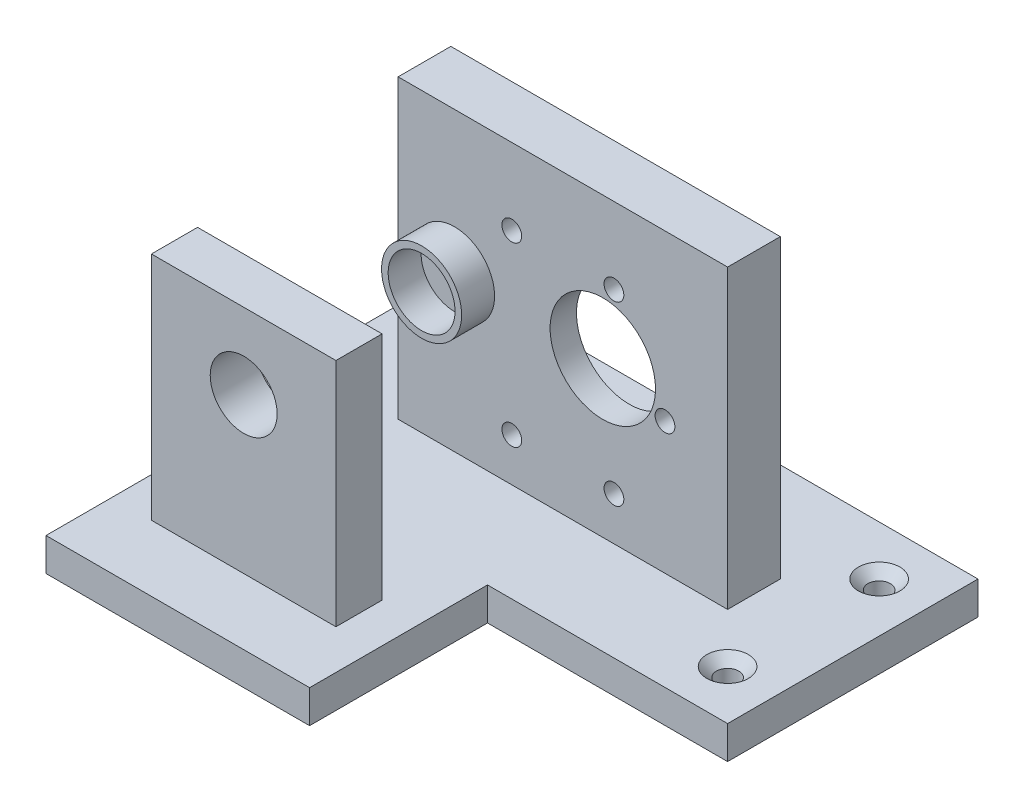
ISO-10303-21;
HEADER;
FILE_DESCRIPTION(('STEP AP214'),'2;1');
FILE_NAME('part.step','',(''),(''),'','','');
FILE_SCHEMA(('AUTOMOTIVE_DESIGN { 1 0 10303 214 1 1 1 1 }'));
ENDSEC;
DATA;
#1=APPLICATION_CONTEXT('core data for automotive mechanical design processes');
#2=APPLICATION_PROTOCOL_DEFINITION('international standard','automotive_design',2000,#1);
#3=PRODUCT_CONTEXT('',#1,'mechanical');
#4=PRODUCT('Part','Part','',(#3));
#5=PRODUCT_RELATED_PRODUCT_CATEGORY('part','',(#4));
#6=PRODUCT_DEFINITION_FORMATION('','',#4);
#7=PRODUCT_DEFINITION_CONTEXT('part definition',#1,'design');
#8=PRODUCT_DEFINITION('design','',#6,#7);
#9=PRODUCT_DEFINITION_SHAPE('','',#8);
#10=(LENGTH_UNIT() NAMED_UNIT(*) SI_UNIT(.MILLI.,.METRE.));
#11=(NAMED_UNIT(*) PLANE_ANGLE_UNIT() SI_UNIT($,.RADIAN.));
#12=(NAMED_UNIT(*) SI_UNIT($,.STERADIAN.) SOLID_ANGLE_UNIT());
#13=UNCERTAINTY_MEASURE_WITH_UNIT(LENGTH_MEASURE(1.E-05),#10,'distance_accuracy_value','');
#14=(GEOMETRIC_REPRESENTATION_CONTEXT(3) GLOBAL_UNCERTAINTY_ASSIGNED_CONTEXT((#13)) GLOBAL_UNIT_ASSIGNED_CONTEXT((#10,
#11,#12)) REPRESENTATION_CONTEXT('',''));
#15=CARTESIAN_POINT('',(0.,0.,0.));
#16=DIRECTION('',(0.,0.,1.));
#17=DIRECTION('',(1.,0.,0.));
#18=AXIS2_PLACEMENT_3D('',#15,#16,#17);
#19=CARTESIAN_POINT('',(0.,0.,15.));
#20=DIRECTION('',(0.,0.,-1.));
#21=DIRECTION('',(1.,0.,0.));
#22=AXIS2_PLACEMENT_3D('',#19,#20,#21);
#23=PLANE('',#22);
#24=DIRECTION('',(0.,-1.,0.));
#25=VECTOR('',#24,1.);
#26=CARTESIAN_POINT('',(3.56217782532956,0.,15.));
#27=LINE('',#26,#25);
#28=CARTESIAN_POINT('',(3.56217782532956,5.00000000000001,15.));
#29=VERTEX_POINT('',#28);
#30=CARTESIAN_POINT('',(3.56217782532956,0.,15.));
#31=VERTEX_POINT('',#30);
#32=EDGE_CURVE('E213',#29,#31,#27,.T.);
#33=ORIENTED_EDGE('',*,*,#32,.T.);
#34=DIRECTION('',(1.,0.,0.));
#35=VECTOR('',#34,1.);
#36=CARTESIAN_POINT('',(-40.,0.,15.));
#37=LINE('',#36,#35);
#38=CARTESIAN_POINT('',(40.,0.,15.));
#39=VERTEX_POINT('',#38);
#40=EDGE_CURVE('E272',#31,#39,#37,.T.);
#41=ORIENTED_EDGE('',*,*,#40,.T.);
#42=DIRECTION('',(0.,1.,0.));
#43=VECTOR('',#42,1.);
#44=CARTESIAN_POINT('',(40.,5.00000000000002,15.));
#45=LINE('',#44,#43);
#46=CARTESIAN_POINT('',(40.,5.00000000000002,15.));
#47=VERTEX_POINT('',#46);
#48=EDGE_CURVE('E276',#39,#47,#45,.T.);
#49=ORIENTED_EDGE('',*,*,#48,.T.);
#50=DIRECTION('',(-1.,0.,0.));
#51=VECTOR('',#50,1.);
#52=CARTESIAN_POINT('',(-40.,5.,15.));
#53=LINE('',#52,#51);
#54=EDGE_CURVE('E280',#47,#29,#53,.T.);
#55=ORIENTED_EDGE('',*,*,#54,.T.);
#56=EDGE_LOOP('',(#33,#41,#49,#55));
#57=FACE_BOUND('',#56,.T.);
#58=ADVANCED_FACE('F41',(#57),#23,.F.);
#59=CARTESIAN_POINT('',(-25.,50.,-8.));
#60=DIRECTION('',(1.,0.,0.));
#61=DIRECTION('',(0.,1.,0.));
#62=AXIS2_PLACEMENT_3D('',#59,#60,#61);
#63=PLANE('',#62);
#64=DIRECTION('',(0.,0.,1.));
#65=VECTOR('',#64,1.);
#66=CARTESIAN_POINT('',(-25.,5.,-8.));
#67=LINE('',#66,#65);
#68=CARTESIAN_POINT('',(-25.,5.,-8.));
#69=VERTEX_POINT('',#68);
#70=CARTESIAN_POINT('',(-25.,5.,0.));
#71=VERTEX_POINT('',#70);
#72=EDGE_CURVE('E306',#69,#71,#67,.T.);
#73=ORIENTED_EDGE('',*,*,#72,.T.);
#74=DIRECTION('',(0.,-1.,0.));
#75=VECTOR('',#74,1.);
#76=CARTESIAN_POINT('',(-25.,50.,0.));
#77=LINE('',#76,#75);
#78=CARTESIAN_POINT('',(-25.,50.,0.));
#79=VERTEX_POINT('',#78);
#80=EDGE_CURVE('E355',#79,#71,#77,.T.);
#81=ORIENTED_EDGE('',*,*,#80,.F.);
#82=DIRECTION('',(0.,0.,1.));
#83=VECTOR('',#82,1.);
#84=CARTESIAN_POINT('',(-25.,50.,-8.));
#85=LINE('',#84,#83);
#86=CARTESIAN_POINT('',(-25.,50.,-8.));
#87=VERTEX_POINT('',#86);
#88=EDGE_CURVE('E368',#87,#79,#85,.T.);
#89=ORIENTED_EDGE('',*,*,#88,.F.);
#90=DIRECTION('',(0.,-1.,0.));
#91=VECTOR('',#90,1.);
#92=CARTESIAN_POINT('',(-25.,50.,-8.));
#93=LINE('',#92,#91);
#94=EDGE_CURVE('E358',#87,#69,#93,.T.);
#95=ORIENTED_EDGE('',*,*,#94,.T.);
#96=EDGE_LOOP('',(#73,#81,#89,#95));
#97=FACE_BOUND('',#96,.T.);
#98=ADVANCED_FACE('F383',(#97),#63,.F.);
#99=CARTESIAN_POINT('',(25.,50.,-8.));
#100=DIRECTION('',(1.,0.,0.));
#101=DIRECTION('',(0.,1.,0.));
#102=AXIS2_PLACEMENT_3D('',#99,#100,#101);
#103=PLANE('',#102);
#104=DIRECTION('',(0.,-1.,0.));
#105=VECTOR('',#104,1.);
#106=CARTESIAN_POINT('',(25.,50.,-8.));
#107=LINE('',#106,#105);
#108=CARTESIAN_POINT('',(25.,50.,-8.));
#109=VERTEX_POINT('',#108);
#110=CARTESIAN_POINT('',(25.,5.00000000000001,-8.));
#111=VERTEX_POINT('',#110);
#112=EDGE_CURVE('E354',#109,#111,#107,.T.);
#113=ORIENTED_EDGE('',*,*,#112,.F.);
#114=DIRECTION('',(0.,0.,1.));
#115=VECTOR('',#114,1.);
#116=CARTESIAN_POINT('',(25.,50.,-8.));
#117=LINE('',#116,#115);
#118=CARTESIAN_POINT('',(25.,50.,0.));
#119=VERTEX_POINT('',#118);
#120=EDGE_CURVE('E361',#109,#119,#117,.T.);
#121=ORIENTED_EDGE('',*,*,#120,.T.);
#122=DIRECTION('',(0.,-1.,0.));
#123=VECTOR('',#122,1.);
#124=CARTESIAN_POINT('',(25.,50.,0.));
#125=LINE('',#124,#123);
#126=CARTESIAN_POINT('',(25.,5.00000000000001,0.));
#127=VERTEX_POINT('',#126);
#128=EDGE_CURVE('E363',#119,#127,#125,.T.);
#129=ORIENTED_EDGE('',*,*,#128,.T.);
#130=DIRECTION('',(0.,0.,1.));
#131=VECTOR('',#130,1.);
#132=CARTESIAN_POINT('',(25.,5.00000000000001,-8.));
#133=LINE('',#132,#131);
#134=EDGE_CURVE('E303',#111,#127,#133,.T.);
#135=ORIENTED_EDGE('',*,*,#134,.F.);
#136=EDGE_LOOP('',(#113,#121,#129,#135));
#137=FACE_BOUND('',#136,.T.);
#138=ADVANCED_FACE('F390',(#137),#103,.T.);
#139=CARTESIAN_POINT('',(0.,0.,-8.));
#140=DIRECTION('',(0.,0.,1.));
#141=DIRECTION('',(-1.,0.,0.));
#142=AXIS2_PLACEMENT_3D('',#139,#140,#141);
#143=PLANE('',#142);
#144=CARTESIAN_POINT('',(0.,25.,-8.));
#145=DIRECTION('',(0.,0.,1.));
#146=DIRECTION('',(1.,0.,0.));
#147=AXIS2_PLACEMENT_3D('',#144,#145,#146);
#148=CIRCLE('',#147,18.5);
#149=CARTESIAN_POINT('',(18.5,25.,-8.));
#150=VERTEX_POINT('',#149);
#151=EDGE_CURVE('E311',#150,#150,#148,.T.);
#152=ORIENTED_EDGE('',*,*,#151,.T.);
#153=EDGE_LOOP('',(#152));
#154=FACE_BOUND('',#153,.T.);
#155=DIRECTION('',(-1.,0.,0.));
#156=VECTOR('',#155,1.);
#157=CARTESIAN_POINT('',(0.,5.00000000000001,-8.));
#158=LINE('',#157,#156);
#159=EDGE_CURVE('E309',#111,#69,#158,.T.);
#160=ORIENTED_EDGE('',*,*,#159,.T.);
#161=ORIENTED_EDGE('',*,*,#94,.F.);
#162=DIRECTION('',(1.,0.,0.));
#163=VECTOR('',#162,1.);
#164=CARTESIAN_POINT('',(-25.,50.,-8.));
#165=LINE('',#164,#163);
#166=EDGE_CURVE('E352',#87,#109,#165,.T.);
#167=ORIENTED_EDGE('',*,*,#166,.T.);
#168=ORIENTED_EDGE('',*,*,#112,.T.);
#169=EDGE_LOOP('',(#160,#161,#167,#168));
#170=FACE_BOUND('',#169,.T.);
#171=ADVANCED_FACE('F386',(#154,#170),#143,.F.);
#172=CARTESIAN_POINT('',(0.,0.,0.));
#173=DIRECTION('',(0.,0.,1.));
#174=DIRECTION('',(-1.,0.,0.));
#175=AXIS2_PLACEMENT_3D('',#172,#173,#174);
#176=PLANE('',#175);
#177=CARTESIAN_POINT('',(-16.4378221746704,28.4999999993294,0.));
#178=DIRECTION('',(0.,0.,-1.));
#179=DIRECTION('',(-1.,0.,0.));
#180=AXIS2_PLACEMENT_3D('',#177,#178,#179);
#181=CIRCLE('',#180,6.08);
#182=CARTESIAN_POINT('',(-22.5178221746704,28.4999999993294,0.));
#183=VERTEX_POINT('',#182);
#184=EDGE_CURVE('E227',#183,#183,#181,.T.);
#185=ORIENTED_EDGE('',*,*,#184,.T.);
#186=EDGE_LOOP('',(#185));
#187=FACE_BOUND('',#186,.T.);
#188=CARTESIAN_POINT('',(-7.74999999999999,38.4233937586588,0.));
#189=DIRECTION('',(0.,0.,1.));
#190=DIRECTION('',(1.,0.,0.));
#191=AXIS2_PLACEMENT_3D('',#188,#189,#190);
#192=CIRCLE('',#191,1.50000000039213);
#193=CARTESIAN_POINT('',(-6.24999999960786,38.4233937586588,0.));
#194=VERTEX_POINT('',#193);
#195=EDGE_CURVE('E337',#194,#194,#192,.T.);
#196=ORIENTED_EDGE('',*,*,#195,.F.);
#197=EDGE_LOOP('',(#196));
#198=FACE_BOUND('',#197,.T.);
#199=CARTESIAN_POINT('',(-7.74999999999999,11.5766062413412,0.));
#200=DIRECTION('',(0.,0.,1.));
#201=DIRECTION('',(1.,0.,0.));
#202=AXIS2_PLACEMENT_3D('',#199,#200,#201);
#203=CIRCLE('',#202,1.50000000039213);
#204=CARTESIAN_POINT('',(-6.24999999960786,11.5766062413412,0.));
#205=VERTEX_POINT('',#204);
#206=EDGE_CURVE('E341',#205,#205,#203,.T.);
#207=ORIENTED_EDGE('',*,*,#206,.F.);
#208=EDGE_LOOP('',(#207));
#209=FACE_BOUND('',#208,.T.);
#210=CARTESIAN_POINT('',(7.75000000000001,11.5766062413412,0.));
#211=DIRECTION('',(0.,0.,1.));
#212=DIRECTION('',(1.,0.,0.));
#213=AXIS2_PLACEMENT_3D('',#210,#211,#212);
#214=CIRCLE('',#213,1.50000000039213);
#215=CARTESIAN_POINT('',(9.25000000039214,11.5766062413412,0.));
#216=VERTEX_POINT('',#215);
#217=EDGE_CURVE('E344',#216,#216,#214,.T.);
#218=ORIENTED_EDGE('',*,*,#217,.F.);
#219=EDGE_LOOP('',(#218));
#220=FACE_BOUND('',#219,.T.);
#221=CARTESIAN_POINT('',(15.5,25.,0.));
#222=DIRECTION('',(0.,0.,1.));
#223=DIRECTION('',(1.,0.,0.));
#224=AXIS2_PLACEMENT_3D('',#221,#222,#223);
#225=CIRCLE('',#224,1.50000000039213);
#226=CARTESIAN_POINT('',(17.0000000003921,25.,0.));
#227=VERTEX_POINT('',#226);
#228=EDGE_CURVE('E336',#227,#227,#225,.T.);
#229=ORIENTED_EDGE('',*,*,#228,.F.);
#230=EDGE_LOOP('',(#229));
#231=FACE_BOUND('',#230,.T.);
#232=CARTESIAN_POINT('',(6.06217782532956,28.4999999993294,0.));
#233=DIRECTION('',(0.,0.,1.));
#234=DIRECTION('',(1.,0.,0.));
#235=AXIS2_PLACEMENT_3D('',#232,#233,#234);
#236=CIRCLE('',#235,8.00000000000001);
#237=CARTESIAN_POINT('',(14.0621778253296,28.4999999993294,0.));
#238=VERTEX_POINT('',#237);
#239=EDGE_CURVE('E333',#238,#238,#236,.T.);
#240=ORIENTED_EDGE('',*,*,#239,.F.);
#241=EDGE_LOOP('',(#240));
#242=FACE_BOUND('',#241,.T.);
#243=CARTESIAN_POINT('',(7.74999999999999,38.4233937586588,0.));
#244=DIRECTION('',(0.,0.,1.));
#245=DIRECTION('',(1.,0.,0.));
#246=AXIS2_PLACEMENT_3D('',#243,#244,#245);
#247=CIRCLE('',#246,1.50000000039214);
#248=CARTESIAN_POINT('',(9.25000000039213,38.4233937586588,0.));
#249=VERTEX_POINT('',#248);
#250=EDGE_CURVE('E340',#249,#249,#247,.T.);
#251=ORIENTED_EDGE('',*,*,#250,.F.);
#252=EDGE_LOOP('',(#251));
#253=FACE_BOUND('',#252,.T.);
#254=ORIENTED_EDGE('',*,*,#128,.F.);
#255=DIRECTION('',(1.,0.,0.));
#256=VECTOR('',#255,1.);
#257=CARTESIAN_POINT('',(-25.,50.,0.));
#258=LINE('',#257,#256);
#259=EDGE_CURVE('E351',#79,#119,#258,.T.);
#260=ORIENTED_EDGE('',*,*,#259,.F.);
#261=ORIENTED_EDGE('',*,*,#80,.T.);
#262=DIRECTION('',(-1.,0.,0.));
#263=VECTOR('',#262,1.);
#264=CARTESIAN_POINT('',(0.,5.00000000000001,0.));
#265=LINE('',#264,#263);
#266=EDGE_CURVE('E49',#127,#71,#265,.T.);
#267=ORIENTED_EDGE('',*,*,#266,.F.);
#268=EDGE_LOOP('',(#254,#260,#261,#267));
#269=FACE_BOUND('',#268,.T.);
#270=ADVANCED_FACE('F380',(#187,#198,#209,#220,#231,#242,#253,#269),#176,.T.);
#271=CARTESIAN_POINT('',(7.74999999999999,38.4233937586588,-10.));
#272=DIRECTION('',(0.,0.,1.));
#273=DIRECTION('',(-1.,0.,0.));
#274=AXIS2_PLACEMENT_3D('',#271,#272,#273);
#275=CYLINDRICAL_SURFACE('',#274,1.50000000039214);
#276=ORIENTED_EDGE('',*,*,#250,.T.);
#277=EDGE_LOOP('',(#276));
#278=FACE_BOUND('',#277,.T.);
#279=CARTESIAN_POINT('',(7.74999999999999,38.4233937586588,-4.));
#280=DIRECTION('',(0.,0.,1.));
#281=DIRECTION('',(1.,0.,0.));
#282=AXIS2_PLACEMENT_3D('',#279,#280,#281);
#283=CIRCLE('',#282,1.50000000039214);
#284=CARTESIAN_POINT('',(9.25000000039213,38.4233937586588,-4.));
#285=VERTEX_POINT('',#284);
#286=EDGE_CURVE('E330',#285,#285,#283,.T.);
#287=ORIENTED_EDGE('',*,*,#286,.F.);
#288=EDGE_LOOP('',(#287));
#289=FACE_BOUND('',#288,.T.);
#290=ADVANCED_FACE('F532',(#278,#289),#275,.F.);
#291=CARTESIAN_POINT('',(6.06217782532956,28.4999999993294,-10.));
#292=DIRECTION('',(0.,0.,1.));
#293=DIRECTION('',(-1.,0.,0.));
#294=AXIS2_PLACEMENT_3D('',#291,#292,#293);
#295=CYLINDRICAL_SURFACE('',#294,8.00000000000001);
#296=ORIENTED_EDGE('',*,*,#239,.T.);
#297=EDGE_LOOP('',(#296));
#298=FACE_BOUND('',#297,.T.);
#299=CARTESIAN_POINT('',(6.06217782532956,28.4999999993294,-4.));
#300=DIRECTION('',(0.,0.,1.));
#301=DIRECTION('',(1.,0.,0.));
#302=AXIS2_PLACEMENT_3D('',#299,#300,#301);
#303=CIRCLE('',#302,8.00000000000001);
#304=CARTESIAN_POINT('',(14.0621778253296,28.4999999993294,-4.));
#305=VERTEX_POINT('',#304);
#306=EDGE_CURVE('E327',#305,#305,#303,.T.);
#307=ORIENTED_EDGE('',*,*,#306,.F.);
#308=EDGE_LOOP('',(#307));
#309=FACE_BOUND('',#308,.T.);
#310=ADVANCED_FACE('F529',(#298,#309),#295,.F.);
#311=CARTESIAN_POINT('',(15.5,25.,-10.));
#312=DIRECTION('',(0.,0.,1.));
#313=DIRECTION('',(-1.,0.,0.));
#314=AXIS2_PLACEMENT_3D('',#311,#312,#313);
#315=CYLINDRICAL_SURFACE('',#314,1.50000000039213);
#316=ORIENTED_EDGE('',*,*,#228,.T.);
#317=EDGE_LOOP('',(#316));
#318=FACE_BOUND('',#317,.T.);
#319=CARTESIAN_POINT('',(15.5,25.,-4.));
#320=DIRECTION('',(0.,0.,1.));
#321=DIRECTION('',(1.,0.,0.));
#322=AXIS2_PLACEMENT_3D('',#319,#320,#321);
#323=CIRCLE('',#322,1.50000000039213);
#324=CARTESIAN_POINT('',(17.0000000003921,25.,-4.));
#325=VERTEX_POINT('',#324);
#326=EDGE_CURVE('E324',#325,#325,#323,.T.);
#327=ORIENTED_EDGE('',*,*,#326,.F.);
#328=EDGE_LOOP('',(#327));
#329=FACE_BOUND('',#328,.T.);
#330=ADVANCED_FACE('F531',(#318,#329),#315,.F.);
#331=CARTESIAN_POINT('',(7.75000000000001,11.5766062413412,-10.));
#332=DIRECTION('',(0.,0.,1.));
#333=DIRECTION('',(-1.,0.,0.));
#334=AXIS2_PLACEMENT_3D('',#331,#332,#333);
#335=CYLINDRICAL_SURFACE('',#334,1.50000000039213);
#336=ORIENTED_EDGE('',*,*,#217,.T.);
#337=EDGE_LOOP('',(#336));
#338=FACE_BOUND('',#337,.T.);
#339=CARTESIAN_POINT('',(7.75000000000001,11.5766062413412,-4.));
#340=DIRECTION('',(0.,0.,1.));
#341=DIRECTION('',(1.,0.,0.));
#342=AXIS2_PLACEMENT_3D('',#339,#340,#341);
#343=CIRCLE('',#342,1.50000000039213);
#344=CARTESIAN_POINT('',(9.25000000039214,11.5766062413412,-4.));
#345=VERTEX_POINT('',#344);
#346=EDGE_CURVE('E321',#345,#345,#343,.T.);
#347=ORIENTED_EDGE('',*,*,#346,.F.);
#348=EDGE_LOOP('',(#347));
#349=FACE_BOUND('',#348,.T.);
#350=ADVANCED_FACE('F537',(#338,#349),#335,.F.);
#351=CARTESIAN_POINT('',(-7.74999999999999,11.5766062413412,-10.));
#352=DIRECTION('',(0.,0.,1.));
#353=DIRECTION('',(-1.,0.,0.));
#354=AXIS2_PLACEMENT_3D('',#351,#352,#353);
#355=CYLINDRICAL_SURFACE('',#354,1.50000000039213);
#356=ORIENTED_EDGE('',*,*,#206,.T.);
#357=EDGE_LOOP('',(#356));
#358=FACE_BOUND('',#357,.T.);
#359=CARTESIAN_POINT('',(-7.74999999999999,11.5766062413412,-4.));
#360=DIRECTION('',(0.,0.,1.));
#361=DIRECTION('',(1.,0.,0.));
#362=AXIS2_PLACEMENT_3D('',#359,#360,#361);
#363=CIRCLE('',#362,1.50000000039213);
#364=CARTESIAN_POINT('',(-6.24999999960786,11.5766062413412,-4.));
#365=VERTEX_POINT('',#364);
#366=EDGE_CURVE('E318',#365,#365,#363,.T.);
#367=ORIENTED_EDGE('',*,*,#366,.F.);
#368=EDGE_LOOP('',(#367));
#369=FACE_BOUND('',#368,.T.);
#370=ADVANCED_FACE('F402',(#358,#369),#355,.F.);
#371=CARTESIAN_POINT('',(-7.74999999999999,38.4233937586588,-10.));
#372=DIRECTION('',(0.,0.,1.));
#373=DIRECTION('',(-1.,0.,0.));
#374=AXIS2_PLACEMENT_3D('',#371,#372,#373);
#375=CYLINDRICAL_SURFACE('',#374,1.50000000039213);
#376=ORIENTED_EDGE('',*,*,#195,.T.);
#377=EDGE_LOOP('',(#376));
#378=FACE_BOUND('',#377,.T.);
#379=CARTESIAN_POINT('',(-7.74999999999999,38.4233937586588,-4.));
#380=DIRECTION('',(0.,0.,1.));
#381=DIRECTION('',(1.,0.,0.));
#382=AXIS2_PLACEMENT_3D('',#379,#380,#381);
#383=CIRCLE('',#382,1.50000000039213);
#384=CARTESIAN_POINT('',(-6.24999999960786,38.4233937586588,-4.));
#385=VERTEX_POINT('',#384);
#386=EDGE_CURVE('E315',#385,#385,#383,.T.);
#387=ORIENTED_EDGE('',*,*,#386,.F.);
#388=EDGE_LOOP('',(#387));
#389=FACE_BOUND('',#388,.T.);
#390=ADVANCED_FACE('F394',(#378,#389),#375,.F.);
#391=CARTESIAN_POINT('',(-25.,50.,-8.));
#392=DIRECTION('',(0.,1.,0.));
#393=DIRECTION('',(-1.,0.,0.));
#394=AXIS2_PLACEMENT_3D('',#391,#392,#393);
#395=PLANE('',#394);
#396=ORIENTED_EDGE('',*,*,#259,.T.);
#397=ORIENTED_EDGE('',*,*,#120,.F.);
#398=ORIENTED_EDGE('',*,*,#166,.F.);
#399=ORIENTED_EDGE('',*,*,#88,.T.);
#400=EDGE_LOOP('',(#396,#397,#398,#399));
#401=FACE_BOUND('',#400,.T.);
#402=ADVANCED_FACE('F43',(#401),#395,.T.);
#403=CARTESIAN_POINT('',(0.,25.,-4.));
#404=DIRECTION('',(0.,0.,-1.));
#405=DIRECTION('',(1.,0.,0.));
#406=AXIS2_PLACEMENT_3D('',#403,#404,#405);
#407=CYLINDRICAL_SURFACE('',#406,18.5);
#408=CARTESIAN_POINT('',(0.,25.,-4.));
#409=DIRECTION('',(0.,0.,1.));
#410=DIRECTION('',(1.,0.,0.));
#411=AXIS2_PLACEMENT_3D('',#408,#409,#410);
#412=CIRCLE('',#411,18.5);
#413=CARTESIAN_POINT('',(18.5,25.,-4.));
#414=VERTEX_POINT('',#413);
#415=EDGE_CURVE('E312',#414,#414,#412,.T.);
#416=ORIENTED_EDGE('',*,*,#415,.T.);
#417=EDGE_LOOP('',(#416));
#418=FACE_BOUND('',#417,.T.);
#419=ORIENTED_EDGE('',*,*,#151,.F.);
#420=EDGE_LOOP('',(#419));
#421=FACE_BOUND('',#420,.T.);
#422=ADVANCED_FACE('F393',(#418,#421),#407,.F.);
#423=CARTESIAN_POINT('',(0.,25.,-4.));
#424=DIRECTION('',(0.,0.,-1.));
#425=DIRECTION('',(1.,0.,0.));
#426=AXIS2_PLACEMENT_3D('',#423,#424,#425);
#427=PLANE('',#426);
#428=ORIENTED_EDGE('',*,*,#286,.T.);
#429=EDGE_LOOP('',(#428));
#430=FACE_BOUND('',#429,.T.);
#431=ORIENTED_EDGE('',*,*,#306,.T.);
#432=EDGE_LOOP('',(#431));
#433=FACE_BOUND('',#432,.T.);
#434=ORIENTED_EDGE('',*,*,#326,.T.);
#435=EDGE_LOOP('',(#434));
#436=FACE_BOUND('',#435,.T.);
#437=ORIENTED_EDGE('',*,*,#346,.T.);
#438=EDGE_LOOP('',(#437));
#439=FACE_BOUND('',#438,.T.);
#440=ORIENTED_EDGE('',*,*,#366,.T.);
#441=EDGE_LOOP('',(#440));
#442=FACE_BOUND('',#441,.T.);
#443=ORIENTED_EDGE('',*,*,#386,.T.);
#444=EDGE_LOOP('',(#443));
#445=FACE_BOUND('',#444,.T.);
#446=ORIENTED_EDGE('',*,*,#415,.F.);
#447=EDGE_LOOP('',(#446));
#448=FACE_BOUND('',#447,.T.);
#449=ADVANCED_FACE('F399',(#430,#433,#436,#439,#442,#445,#448),#427,.T.);
#450=CARTESIAN_POINT('',(-40.,5.,-23.));
#451=DIRECTION('',(0.,-1.,0.));
#452=DIRECTION('',(1.,0.,0.));
#453=AXIS2_PLACEMENT_3D('',#450,#451,#452);
#454=PLANE('',#453);
#455=DIRECTION('',(-1.,0.,0.));
#456=VECTOR('',#455,1.);
#457=CARTESIAN_POINT('',(-2.43782217467043,5.00000000000001,25.));
#458=LINE('',#457,#456);
#459=CARTESIAN_POINT('',(-2.43782217467043,5.00000000000001,25.));
#460=VERTEX_POINT('',#459);
#461=CARTESIAN_POINT('',(-30.4378221746704,5.00000000000001,25.));
#462=VERTEX_POINT('',#461);
#463=EDGE_CURVE('E193',#460,#462,#458,.T.);
#464=ORIENTED_EDGE('',*,*,#463,.F.);
#465=DIRECTION('',(0.,0.,-1.));
#466=VECTOR('',#465,1.);
#467=CARTESIAN_POINT('',(-2.43782217467043,5.00000000000001,32.));
#468=LINE('',#467,#466);
#469=CARTESIAN_POINT('',(-2.43782217467043,5.00000000000001,32.));
#470=VERTEX_POINT('',#469);
#471=EDGE_CURVE('E182',#470,#460,#468,.T.);
#472=ORIENTED_EDGE('',*,*,#471,.F.);
#473=DIRECTION('',(-1.,0.,0.));
#474=VECTOR('',#473,1.);
#475=CARTESIAN_POINT('',(-2.43782217467043,5.00000000000001,32.));
#476=LINE('',#475,#474);
#477=CARTESIAN_POINT('',(-30.4378221746704,5.00000000000001,32.));
#478=VERTEX_POINT('',#477);
#479=EDGE_CURVE('E164',#470,#478,#476,.T.);
#480=ORIENTED_EDGE('',*,*,#479,.T.);
#481=DIRECTION('',(0.,0.,-1.));
#482=VECTOR('',#481,1.);
#483=CARTESIAN_POINT('',(-30.4378221746704,5.00000000000001,32.));
#484=LINE('',#483,#482);
#485=EDGE_CURVE('E171',#478,#462,#484,.T.);
#486=ORIENTED_EDGE('',*,*,#485,.T.);
#487=EDGE_LOOP('',(#464,#472,#480,#486));
#488=FACE_BOUND('',#487,.T.);
#489=CARTESIAN_POINT('',(-32.5,5.,7.5));
#490=DIRECTION('',(0.,-1.,0.));
#491=DIRECTION('',(0.,0.,-1.));
#492=AXIS2_PLACEMENT_3D('',#489,#490,#491);
#493=CIRCLE('',#492,3.15);
#494=CARTESIAN_POINT('',(-32.5,5.,4.35));
#495=VERTEX_POINT('',#494);
#496=EDGE_CURVE('E231',#495,#495,#493,.T.);
#497=ORIENTED_EDGE('',*,*,#496,.T.);
#498=EDGE_LOOP('',(#497));
#499=FACE_BOUND('',#498,.T.);
#500=CARTESIAN_POINT('',(-32.5,5.,-15.5));
#501=DIRECTION('',(0.,-1.,0.));
#502=DIRECTION('',(0.,0.,-1.));
#503=AXIS2_PLACEMENT_3D('',#500,#501,#502);
#504=CIRCLE('',#503,3.15);
#505=CARTESIAN_POINT('',(-32.5,5.,-18.65));
#506=VERTEX_POINT('',#505);
#507=EDGE_CURVE('E242',#506,#506,#504,.T.);
#508=ORIENTED_EDGE('',*,*,#507,.T.);
#509=EDGE_LOOP('',(#508));
#510=FACE_BOUND('',#509,.T.);
#511=CARTESIAN_POINT('',(32.5,5.00000000000002,-15.5));
#512=DIRECTION('',(0.,-1.,0.));
#513=DIRECTION('',(0.,0.,-1.));
#514=AXIS2_PLACEMENT_3D('',#511,#512,#513);
#515=CIRCLE('',#514,3.15);
#516=CARTESIAN_POINT('',(32.5,5.00000000000002,-18.65));
#517=VERTEX_POINT('',#516);
#518=EDGE_CURVE('E251',#517,#517,#515,.T.);
#519=ORIENTED_EDGE('',*,*,#518,.T.);
#520=EDGE_LOOP('',(#519));
#521=FACE_BOUND('',#520,.T.);
#522=CARTESIAN_POINT('',(32.5,5.00000000000002,7.5));
#523=DIRECTION('',(0.,-1.,0.));
#524=DIRECTION('',(0.,0.,-1.));
#525=AXIS2_PLACEMENT_3D('',#522,#523,#524);
#526=CIRCLE('',#525,3.15);
#527=CARTESIAN_POINT('',(32.5,5.00000000000002,4.35));
#528=VERTEX_POINT('',#527);
#529=EDGE_CURVE('E260',#528,#528,#526,.T.);
#530=ORIENTED_EDGE('',*,*,#529,.T.);
#531=EDGE_LOOP('',(#530));
#532=FACE_BOUND('',#531,.T.);
#533=DIRECTION('',(0.,0.,1.));
#534=VECTOR('',#533,1.);
#535=CARTESIAN_POINT('',(40.,5.00000000000002,-23.));
#536=LINE('',#535,#534);
#537=CARTESIAN_POINT('',(40.,5.00000000000002,-23.));
#538=VERTEX_POINT('',#537);
#539=EDGE_CURVE('E296',#538,#47,#536,.T.);
#540=ORIENTED_EDGE('',*,*,#539,.F.);
#541=DIRECTION('',(-1.,0.,0.));
#542=VECTOR('',#541,1.);
#543=CARTESIAN_POINT('',(-40.,5.,-23.));
#544=LINE('',#543,#542);
#545=CARTESIAN_POINT('',(-40.,5.,-23.));
#546=VERTEX_POINT('',#545);
#547=EDGE_CURVE('E290',#538,#546,#544,.T.);
#548=ORIENTED_EDGE('',*,*,#547,.T.);
#549=DIRECTION('',(0.,0.,1.));
#550=VECTOR('',#549,1.);
#551=CARTESIAN_POINT('',(-40.,5.,-23.));
#552=LINE('',#551,#550);
#553=CARTESIAN_POINT('',(-40.,5.,15.));
#554=VERTEX_POINT('',#553);
#555=EDGE_CURVE('E293',#546,#554,#552,.T.);
#556=ORIENTED_EDGE('',*,*,#555,.T.);
#557=CARTESIAN_POINT('',(-36.4378221746704,5.,15.));
#558=VERTEX_POINT('',#557);
#559=EDGE_CURVE('E279',#558,#554,#53,.T.);
#560=ORIENTED_EDGE('',*,*,#559,.F.);
#561=DIRECTION('',(0.,0.,-1.));
#562=VECTOR('',#561,1.);
#563=CARTESIAN_POINT('',(-36.4378221746704,5.,25.));
#564=LINE('',#563,#562);
#565=CARTESIAN_POINT('',(-36.4378221746704,5.00000000000001,42.));
#566=VERTEX_POINT('',#565);
#567=EDGE_CURVE('E220',#566,#558,#564,.T.);
#568=ORIENTED_EDGE('',*,*,#567,.F.);
#569=DIRECTION('',(1.,0.,0.));
#570=VECTOR('',#569,1.);
#571=CARTESIAN_POINT('',(3.56217782532956,5.00000000000001,42.));
#572=LINE('',#571,#570);
#573=CARTESIAN_POINT('',(3.56217782532956,5.00000000000001,42.));
#574=VERTEX_POINT('',#573);
#575=EDGE_CURVE('E208',#566,#574,#572,.T.);
#576=ORIENTED_EDGE('',*,*,#575,.T.);
#577=DIRECTION('',(0.,0.,-1.));
#578=VECTOR('',#577,1.);
#579=CARTESIAN_POINT('',(3.56217782532956,5.00000000000001,25.));
#580=LINE('',#579,#578);
#581=EDGE_CURVE('E218',#574,#29,#580,.T.);
#582=ORIENTED_EDGE('',*,*,#581,.T.);
#583=ORIENTED_EDGE('',*,*,#54,.F.);
#584=EDGE_LOOP('',(#540,#548,#556,#560,#568,#576,#582,#583));
#585=FACE_BOUND('',#584,.T.);
#586=ORIENTED_EDGE('',*,*,#134,.T.);
#587=ORIENTED_EDGE('',*,*,#266,.T.);
#588=ORIENTED_EDGE('',*,*,#72,.F.);
#589=ORIENTED_EDGE('',*,*,#159,.F.);
#590=EDGE_LOOP('',(#586,#587,#588,#589));
#591=FACE_BOUND('',#590,.T.);
#592=ADVANCED_FACE('F180',(#488,#499,#510,#521,#532,#585,#591),#454,.F.);
#593=CARTESIAN_POINT('',(-40.,5.,-23.));
#594=DIRECTION('',(1.,0.,0.));
#595=DIRECTION('',(0.,0.,1.));
#596=AXIS2_PLACEMENT_3D('',#593,#594,#595);
#597=PLANE('',#596);
#598=ORIENTED_EDGE('',*,*,#555,.F.);
#599=DIRECTION('',(0.,-1.,0.));
#600=VECTOR('',#599,1.);
#601=CARTESIAN_POINT('',(-40.,5.,-23.));
#602=LINE('',#601,#600);
#603=CARTESIAN_POINT('',(-40.,0.,-23.));
#604=VERTEX_POINT('',#603);
#605=EDGE_CURVE('E283',#546,#604,#602,.T.);
#606=ORIENTED_EDGE('',*,*,#605,.T.);
#607=DIRECTION('',(0.,0.,1.));
#608=VECTOR('',#607,1.);
#609=CARTESIAN_POINT('',(-40.,0.,-23.));
#610=LINE('',#609,#608);
#611=CARTESIAN_POINT('',(-40.,0.,15.));
#612=VERTEX_POINT('',#611);
#613=EDGE_CURVE('E300',#604,#612,#610,.T.);
#614=ORIENTED_EDGE('',*,*,#613,.T.);
#615=DIRECTION('',(0.,-1.,0.));
#616=VECTOR('',#615,1.);
#617=CARTESIAN_POINT('',(-40.,5.,15.));
#618=LINE('',#617,#616);
#619=EDGE_CURVE('E269',#554,#612,#618,.T.);
#620=ORIENTED_EDGE('',*,*,#619,.F.);
#621=EDGE_LOOP('',(#598,#606,#614,#620));
#622=FACE_BOUND('',#621,.T.);
#623=ADVANCED_FACE('F436',(#622),#597,.F.);
#624=CARTESIAN_POINT('',(40.,5.00000000000002,-23.));
#625=DIRECTION('',(-1.,0.,0.));
#626=DIRECTION('',(0.,0.,-1.));
#627=AXIS2_PLACEMENT_3D('',#624,#625,#626);
#628=PLANE('',#627);
#629=DIRECTION('',(0.,0.,1.));
#630=VECTOR('',#629,1.);
#631=CARTESIAN_POINT('',(40.,0.,-23.));
#632=LINE('',#631,#630);
#633=CARTESIAN_POINT('',(40.,0.,-23.));
#634=VERTEX_POINT('',#633);
#635=EDGE_CURVE('E298',#634,#39,#632,.T.);
#636=ORIENTED_EDGE('',*,*,#635,.F.);
#637=DIRECTION('',(0.,1.,0.));
#638=VECTOR('',#637,1.);
#639=CARTESIAN_POINT('',(40.,5.00000000000002,-23.));
#640=LINE('',#639,#638);
#641=EDGE_CURVE('E288',#634,#538,#640,.T.);
#642=ORIENTED_EDGE('',*,*,#641,.T.);
#643=ORIENTED_EDGE('',*,*,#539,.T.);
#644=ORIENTED_EDGE('',*,*,#48,.F.);
#645=EDGE_LOOP('',(#636,#642,#643,#644));
#646=FACE_BOUND('',#645,.T.);
#647=ADVANCED_FACE('F426',(#646),#628,.F.);
#648=CARTESIAN_POINT('',(0.,0.,-23.));
#649=DIRECTION('',(0.,0.,-1.));
#650=DIRECTION('',(1.,0.,0.));
#651=AXIS2_PLACEMENT_3D('',#648,#649,#650);
#652=PLANE('',#651);
#653=ORIENTED_EDGE('',*,*,#605,.F.);
#654=ORIENTED_EDGE('',*,*,#547,.F.);
#655=ORIENTED_EDGE('',*,*,#641,.F.);
#656=DIRECTION('',(1.,0.,0.));
#657=VECTOR('',#656,1.);
#658=CARTESIAN_POINT('',(-40.,0.,-23.));
#659=LINE('',#658,#657);
#660=EDGE_CURVE('E286',#604,#634,#659,.T.);
#661=ORIENTED_EDGE('',*,*,#660,.F.);
#662=EDGE_LOOP('',(#653,#654,#655,#661));
#663=FACE_BOUND('',#662,.T.);
#664=ADVANCED_FACE('F417',(#663),#652,.T.);
#665=ORIENTED_EDGE('',*,*,#559,.T.);
#666=ORIENTED_EDGE('',*,*,#619,.T.);
#667=CARTESIAN_POINT('',(-36.4378221746704,0.,15.));
#668=VERTEX_POINT('',#667);
#669=EDGE_CURVE('E273',#612,#668,#37,.T.);
#670=ORIENTED_EDGE('',*,*,#669,.T.);
#671=DIRECTION('',(0.,-1.,0.));
#672=VECTOR('',#671,1.);
#673=CARTESIAN_POINT('',(-36.4378221746704,0.,15.));
#674=LINE('',#673,#672);
#675=EDGE_CURVE('E211',#558,#668,#674,.T.);
#676=ORIENTED_EDGE('',*,*,#675,.F.);
#677=EDGE_LOOP('',(#665,#666,#670,#676));
#678=FACE_BOUND('',#677,.T.);
#679=ADVANCED_FACE('F408',(#678),#23,.F.);
#680=CARTESIAN_POINT('',(-25.,0.,-8.));
#681=DIRECTION('',(0.,1.,0.));
#682=DIRECTION('',(-1.,0.,0.));
#683=AXIS2_PLACEMENT_3D('',#680,#681,#682);
#684=PLANE('',#683);
#685=CARTESIAN_POINT('',(-32.5,0.,7.5));
#686=DIRECTION('',(0.,-1.,0.));
#687=DIRECTION('',(0.,0.,-1.));
#688=AXIS2_PLACEMENT_3D('',#685,#686,#687);
#689=CIRCLE('',#688,1.69999999999999);
#690=CARTESIAN_POINT('',(-32.5,0.,5.80000000000001));
#691=VERTEX_POINT('',#690);
#692=EDGE_CURVE('E239',#691,#691,#689,.T.);
#693=ORIENTED_EDGE('',*,*,#692,.F.);
#694=EDGE_LOOP('',(#693));
#695=FACE_BOUND('',#694,.T.);
#696=CARTESIAN_POINT('',(-32.5,0.,-15.5));
#697=DIRECTION('',(0.,-1.,0.));
#698=DIRECTION('',(0.,0.,-1.));
#699=AXIS2_PLACEMENT_3D('',#696,#697,#698);
#700=CIRCLE('',#699,1.69999999999999);
#701=CARTESIAN_POINT('',(-32.5,0.,-17.2));
#702=VERTEX_POINT('',#701);
#703=EDGE_CURVE('E248',#702,#702,#700,.T.);
#704=ORIENTED_EDGE('',*,*,#703,.F.);
#705=EDGE_LOOP('',(#704));
#706=FACE_BOUND('',#705,.T.);
#707=CARTESIAN_POINT('',(32.5,0.,-15.5));
#708=DIRECTION('',(0.,-1.,0.));
#709=DIRECTION('',(0.,0.,-1.));
#710=AXIS2_PLACEMENT_3D('',#707,#708,#709);
#711=CIRCLE('',#710,1.69999999999999);
#712=CARTESIAN_POINT('',(32.5,0.,-17.2));
#713=VERTEX_POINT('',#712);
#714=EDGE_CURVE('E257',#713,#713,#711,.T.);
#715=ORIENTED_EDGE('',*,*,#714,.F.);
#716=EDGE_LOOP('',(#715));
#717=FACE_BOUND('',#716,.T.);
#718=CARTESIAN_POINT('',(32.5,0.,7.5));
#719=DIRECTION('',(0.,-1.,0.));
#720=DIRECTION('',(0.,0.,-1.));
#721=AXIS2_PLACEMENT_3D('',#718,#719,#720);
#722=CIRCLE('',#721,1.69999999999999);
#723=CARTESIAN_POINT('',(32.5,0.,5.80000000000001));
#724=VERTEX_POINT('',#723);
#725=EDGE_CURVE('E266',#724,#724,#722,.T.);
#726=ORIENTED_EDGE('',*,*,#725,.F.);
#727=EDGE_LOOP('',(#726));
#728=FACE_BOUND('',#727,.T.);
#729=ORIENTED_EDGE('',*,*,#613,.F.);
#730=ORIENTED_EDGE('',*,*,#660,.T.);
#731=ORIENTED_EDGE('',*,*,#635,.T.);
#732=ORIENTED_EDGE('',*,*,#40,.F.);
#733=DIRECTION('',(0.,0.,-1.));
#734=VECTOR('',#733,1.);
#735=CARTESIAN_POINT('',(3.56217782532956,0.,25.));
#736=LINE('',#735,#734);
#737=CARTESIAN_POINT('',(3.56217782532956,0.,42.));
#738=VERTEX_POINT('',#737);
#739=EDGE_CURVE('E216',#738,#31,#736,.T.);
#740=ORIENTED_EDGE('',*,*,#739,.F.);
#741=DIRECTION('',(-1.,0.,0.));
#742=VECTOR('',#741,1.);
#743=CARTESIAN_POINT('',(3.56217782532956,0.,42.));
#744=LINE('',#743,#742);
#745=CARTESIAN_POINT('',(-36.4378221746704,0.,42.));
#746=VERTEX_POINT('',#745);
#747=EDGE_CURVE('E204',#738,#746,#744,.T.);
#748=ORIENTED_EDGE('',*,*,#747,.T.);
#749=DIRECTION('',(0.,0.,-1.));
#750=VECTOR('',#749,1.);
#751=CARTESIAN_POINT('',(-36.4378221746704,0.,25.));
#752=LINE('',#751,#750);
#753=EDGE_CURVE('E64',#746,#668,#752,.T.);
#754=ORIENTED_EDGE('',*,*,#753,.T.);
#755=ORIENTED_EDGE('',*,*,#669,.F.);
#756=EDGE_LOOP('',(#729,#730,#731,#732,#740,#748,#754,#755));
#757=FACE_BOUND('',#756,.T.);
#758=ADVANCED_FACE('F416',(#695,#706,#717,#728,#757),#684,.F.);
#759=CARTESIAN_POINT('',(32.5,5.00000000000001,7.5));
#760=DIRECTION('',(0.,1.,0.));
#761=DIRECTION('',(0.,0.,-1.));
#762=AXIS2_PLACEMENT_3D('',#759,#760,#761);
#763=CYLINDRICAL_SURFACE('',#762,1.69999999999999);
#764=ORIENTED_EDGE('',*,*,#725,.T.);
#765=EDGE_LOOP('',(#764));
#766=FACE_BOUND('',#765,.T.);
#767=CARTESIAN_POINT('',(32.5,3.55000000000001,7.5));
#768=DIRECTION('',(0.,-1.,0.));
#769=DIRECTION('',(0.,0.,-1.));
#770=AXIS2_PLACEMENT_3D('',#767,#768,#769);
#771=CIRCLE('',#770,1.69999999999999);
#772=CARTESIAN_POINT('',(32.5,3.55000000000001,5.80000000000001));
#773=VERTEX_POINT('',#772);
#774=EDGE_CURVE('E263',#773,#773,#771,.T.);
#775=ORIENTED_EDGE('',*,*,#774,.F.);
#776=EDGE_LOOP('',(#775));
#777=FACE_BOUND('',#776,.T.);
#778=ADVANCED_FACE('F423',(#766,#777),#763,.F.);
#779=CARTESIAN_POINT('',(32.5,5.00000000000002,7.5));
#780=DIRECTION('',(0.,1.,0.));
#781=DIRECTION('',(0.,0.,-1.));
#782=AXIS2_PLACEMENT_3D('',#779,#780,#781);
#783=CONICAL_SURFACE('',#782,3.15,0.78539816339745);
#784=ORIENTED_EDGE('',*,*,#774,.T.);
#785=EDGE_LOOP('',(#784));
#786=FACE_BOUND('',#785,.T.);
#787=ORIENTED_EDGE('',*,*,#529,.F.);
#788=EDGE_LOOP('',(#787));
#789=FACE_BOUND('',#788,.T.);
#790=ADVANCED_FACE('F503',(#786,#789),#783,.F.);
#791=CARTESIAN_POINT('',(32.5,5.00000000000001,-15.5));
#792=DIRECTION('',(0.,1.,0.));
#793=DIRECTION('',(0.,0.,-1.));
#794=AXIS2_PLACEMENT_3D('',#791,#792,#793);
#795=CYLINDRICAL_SURFACE('',#794,1.69999999999999);
#796=ORIENTED_EDGE('',*,*,#714,.T.);
#797=EDGE_LOOP('',(#796));
#798=FACE_BOUND('',#797,.T.);
#799=CARTESIAN_POINT('',(32.5,3.55000000000001,-15.5));
#800=DIRECTION('',(0.,-1.,0.));
#801=DIRECTION('',(0.,0.,-1.));
#802=AXIS2_PLACEMENT_3D('',#799,#800,#801);
#803=CIRCLE('',#802,1.69999999999999);
#804=CARTESIAN_POINT('',(32.5,3.55000000000001,-17.2));
#805=VERTEX_POINT('',#804);
#806=EDGE_CURVE('E254',#805,#805,#803,.T.);
#807=ORIENTED_EDGE('',*,*,#806,.F.);
#808=EDGE_LOOP('',(#807));
#809=FACE_BOUND('',#808,.T.);
#810=ADVANCED_FACE('F499',(#798,#809),#795,.F.);
#811=CARTESIAN_POINT('',(32.5,5.00000000000002,-15.5));
#812=DIRECTION('',(0.,1.,0.));
#813=DIRECTION('',(0.,0.,-1.));
#814=AXIS2_PLACEMENT_3D('',#811,#812,#813);
#815=CONICAL_SURFACE('',#814,3.15,0.78539816339745);
#816=ORIENTED_EDGE('',*,*,#806,.T.);
#817=EDGE_LOOP('',(#816));
#818=FACE_BOUND('',#817,.T.);
#819=ORIENTED_EDGE('',*,*,#518,.F.);
#820=EDGE_LOOP('',(#819));
#821=FACE_BOUND('',#820,.T.);
#822=ADVANCED_FACE('F495',(#818,#821),#815,.F.);
#823=CARTESIAN_POINT('',(-32.5,5.,-15.5));
#824=DIRECTION('',(0.,1.,0.));
#825=DIRECTION('',(0.,0.,-1.));
#826=AXIS2_PLACEMENT_3D('',#823,#824,#825);
#827=CYLINDRICAL_SURFACE('',#826,1.69999999999999);
#828=ORIENTED_EDGE('',*,*,#703,.T.);
#829=EDGE_LOOP('',(#828));
#830=FACE_BOUND('',#829,.T.);
#831=CARTESIAN_POINT('',(-32.5,3.54999999999999,-15.5));
#832=DIRECTION('',(0.,-1.,0.));
#833=DIRECTION('',(0.,0.,-1.));
#834=AXIS2_PLACEMENT_3D('',#831,#832,#833);
#835=CIRCLE('',#834,1.69999999999999);
#836=CARTESIAN_POINT('',(-32.5,3.54999999999999,-17.2));
#837=VERTEX_POINT('',#836);
#838=EDGE_CURVE('E245',#837,#837,#835,.T.);
#839=ORIENTED_EDGE('',*,*,#838,.F.);
#840=EDGE_LOOP('',(#839));
#841=FACE_BOUND('',#840,.T.);
#842=ADVANCED_FACE('F491',(#830,#841),#827,.F.);
#843=CARTESIAN_POINT('',(-32.5,5.,-15.5));
#844=DIRECTION('',(0.,1.,0.));
#845=DIRECTION('',(0.,0.,-1.));
#846=AXIS2_PLACEMENT_3D('',#843,#844,#845);
#847=CONICAL_SURFACE('',#846,3.15,0.78539816339745);
#848=ORIENTED_EDGE('',*,*,#838,.T.);
#849=EDGE_LOOP('',(#848));
#850=FACE_BOUND('',#849,.T.);
#851=ORIENTED_EDGE('',*,*,#507,.F.);
#852=EDGE_LOOP('',(#851));
#853=FACE_BOUND('',#852,.T.);
#854=ADVANCED_FACE('F487',(#850,#853),#847,.F.);
#855=CARTESIAN_POINT('',(-32.5,5.,7.5));
#856=DIRECTION('',(0.,1.,0.));
#857=DIRECTION('',(0.,0.,-1.));
#858=AXIS2_PLACEMENT_3D('',#855,#856,#857);
#859=CYLINDRICAL_SURFACE('',#858,1.69999999999999);
#860=ORIENTED_EDGE('',*,*,#692,.T.);
#861=EDGE_LOOP('',(#860));
#862=FACE_BOUND('',#861,.T.);
#863=CARTESIAN_POINT('',(-32.5,3.54999999999999,7.5));
#864=DIRECTION('',(0.,-1.,0.));
#865=DIRECTION('',(0.,0.,-1.));
#866=AXIS2_PLACEMENT_3D('',#863,#864,#865);
#867=CIRCLE('',#866,1.69999999999999);
#868=CARTESIAN_POINT('',(-32.5,3.54999999999999,5.80000000000001));
#869=VERTEX_POINT('',#868);
#870=EDGE_CURVE('E236',#869,#869,#867,.T.);
#871=ORIENTED_EDGE('',*,*,#870,.F.);
#872=EDGE_LOOP('',(#871));
#873=FACE_BOUND('',#872,.T.);
#874=ADVANCED_FACE('F483',(#862,#873),#859,.F.);
#875=CARTESIAN_POINT('',(-32.5,5.,7.5));
#876=DIRECTION('',(0.,1.,0.));
#877=DIRECTION('',(0.,0.,-1.));
#878=AXIS2_PLACEMENT_3D('',#875,#876,#877);
#879=CONICAL_SURFACE('',#878,3.15,0.78539816339745);
#880=ORIENTED_EDGE('',*,*,#870,.T.);
#881=EDGE_LOOP('',(#880));
#882=FACE_BOUND('',#881,.T.);
#883=ORIENTED_EDGE('',*,*,#496,.F.);
#884=EDGE_LOOP('',(#883));
#885=FACE_BOUND('',#884,.T.);
#886=ADVANCED_FACE('F476',(#882,#885),#879,.F.);
#887=CARTESIAN_POINT('',(-16.4378221746704,28.4999999993294,5.));
#888=DIRECTION('',(0.,0.,1.));
#889=DIRECTION('',(-1.,0.,0.));
#890=AXIS2_PLACEMENT_3D('',#887,#888,#889);
#891=PLANE('',#890);
#892=CARTESIAN_POINT('',(-16.4378221746704,28.4999999993294,5.));
#893=DIRECTION('',(0.,0.,-1.));
#894=DIRECTION('',(-1.,0.,0.));
#895=AXIS2_PLACEMENT_3D('',#892,#893,#894);
#896=CIRCLE('',#895,6.08);
#897=CARTESIAN_POINT('',(-22.5178221746704,28.4999999993294,5.));
#898=VERTEX_POINT('',#897);
#899=EDGE_CURVE('E228',#898,#898,#896,.T.);
#900=ORIENTED_EDGE('',*,*,#899,.F.);
#901=EDGE_LOOP('',(#900));
#902=FACE_BOUND('',#901,.T.);
#903=CARTESIAN_POINT('',(-16.4378221746704,28.4999999993294,5.));
#904=DIRECTION('',(0.,0.,-1.));
#905=DIRECTION('',(-1.,0.,0.));
#906=AXIS2_PLACEMENT_3D('',#903,#904,#905);
#907=CIRCLE('',#906,5.08);
#908=CARTESIAN_POINT('',(-21.5178221746704,28.4999999993294,5.));
#909=VERTEX_POINT('',#908);
#910=EDGE_CURVE('E224',#909,#909,#907,.T.);
#911=ORIENTED_EDGE('',*,*,#910,.T.);
#912=EDGE_LOOP('',(#911));
#913=FACE_BOUND('',#912,.T.);
#914=ADVANCED_FACE('F473',(#902,#913),#891,.T.);
#915=CARTESIAN_POINT('',(-16.4378221746704,28.4999999993294,5.));
#916=DIRECTION('',(0.,0.,-1.));
#917=DIRECTION('',(1.,0.,0.));
#918=AXIS2_PLACEMENT_3D('',#915,#916,#917);
#919=CYLINDRICAL_SURFACE('',#918,6.08);
#920=ORIENTED_EDGE('',*,*,#899,.T.);
#921=EDGE_LOOP('',(#920));
#922=FACE_BOUND('',#921,.T.);
#923=ORIENTED_EDGE('',*,*,#184,.F.);
#924=EDGE_LOOP('',(#923));
#925=FACE_BOUND('',#924,.T.);
#926=ADVANCED_FACE('F471',(#922,#925),#919,.T.);
#927=CARTESIAN_POINT('',(-16.4378221746704,28.4999999993294,5.));
#928=DIRECTION('',(0.,0.,-1.));
#929=DIRECTION('',(1.,0.,0.));
#930=AXIS2_PLACEMENT_3D('',#927,#928,#929);
#931=CYLINDRICAL_SURFACE('',#930,5.08);
#932=ORIENTED_EDGE('',*,*,#910,.F.);
#933=EDGE_LOOP('',(#932));
#934=FACE_BOUND('',#933,.T.);
#935=CARTESIAN_POINT('',(-16.4378221746704,28.4999999993294,0.));
#936=DIRECTION('',(0.,0.,-1.));
#937=DIRECTION('',(-1.,0.,0.));
#938=AXIS2_PLACEMENT_3D('',#935,#936,#937);
#939=CIRCLE('',#938,5.08);
#940=CARTESIAN_POINT('',(-21.5178221746704,28.4999999993294,0.));
#941=VERTEX_POINT('',#940);
#942=EDGE_CURVE('E11',#941,#941,#939,.F.);
#943=ORIENTED_EDGE('',*,*,#942,.F.);
#944=EDGE_LOOP('',(#943));
#945=FACE_BOUND('',#944,.T.);
#946=ADVANCED_FACE('F464',(#934,#945),#931,.F.);
#947=ORIENTED_EDGE('',*,*,#942,.T.);
#948=EDGE_LOOP('',(#947));
#949=FACE_BOUND('',#948,.T.);
#950=ADVANCED_FACE('F457',(#949),#176,.T.);
#951=CARTESIAN_POINT('',(-36.4378221746704,0.,25.));
#952=DIRECTION('',(-1.,0.,0.));
#953=DIRECTION('',(0.,-1.,0.));
#954=AXIS2_PLACEMENT_3D('',#951,#952,#953);
#955=PLANE('',#954);
#956=ORIENTED_EDGE('',*,*,#675,.T.);
#957=ORIENTED_EDGE('',*,*,#753,.F.);
#958=DIRECTION('',(0.,1.,0.));
#959=VECTOR('',#958,1.);
#960=CARTESIAN_POINT('',(-36.4378221746704,5.00000000000001,42.));
#961=LINE('',#960,#959);
#962=EDGE_CURVE('E206',#746,#566,#961,.T.);
#963=ORIENTED_EDGE('',*,*,#962,.T.);
#964=ORIENTED_EDGE('',*,*,#567,.T.);
#965=EDGE_LOOP('',(#956,#957,#963,#964));
#966=FACE_BOUND('',#965,.T.);
#967=ADVANCED_FACE('F455',(#966),#955,.T.);
#968=CARTESIAN_POINT('',(3.56217782532956,0.,25.));
#969=DIRECTION('',(-1.,0.,0.));
#970=DIRECTION('',(0.,-1.,0.));
#971=AXIS2_PLACEMENT_3D('',#968,#969,#970);
#972=PLANE('',#971);
#973=ORIENTED_EDGE('',*,*,#32,.F.);
#974=ORIENTED_EDGE('',*,*,#581,.F.);
#975=DIRECTION('',(0.,-1.,0.));
#976=VECTOR('',#975,1.);
#977=CARTESIAN_POINT('',(3.56217782532956,5.00000000000001,42.));
#978=LINE('',#977,#976);
#979=EDGE_CURVE('E177',#574,#738,#978,.T.);
#980=ORIENTED_EDGE('',*,*,#979,.T.);
#981=ORIENTED_EDGE('',*,*,#739,.T.);
#982=EDGE_LOOP('',(#973,#974,#980,#981));
#983=FACE_BOUND('',#982,.T.);
#984=ADVANCED_FACE('F449',(#983),#972,.F.);
#985=CARTESIAN_POINT('',(0.,0.,42.));
#986=DIRECTION('',(0.,0.,1.));
#987=DIRECTION('',(-1.,0.,0.));
#988=AXIS2_PLACEMENT_3D('',#985,#986,#987);
#989=PLANE('',#988);
#990=ORIENTED_EDGE('',*,*,#979,.F.);
#991=ORIENTED_EDGE('',*,*,#575,.F.);
#992=ORIENTED_EDGE('',*,*,#962,.F.);
#993=ORIENTED_EDGE('',*,*,#747,.F.);
#994=EDGE_LOOP('',(#990,#991,#992,#993));
#995=FACE_BOUND('',#994,.T.);
#996=ADVANCED_FACE('F453',(#995),#989,.T.);
#997=CARTESIAN_POINT('',(0.,0.,32.));
#998=DIRECTION('',(0.,0.,-1.));
#999=DIRECTION('',(1.,0.,0.));
#1000=AXIS2_PLACEMENT_3D('',#997,#998,#999);
#1001=PLANE('',#1000);
#1002=ORIENTED_EDGE('',*,*,#479,.F.);
#1003=DIRECTION('',(0.,1.,0.));
#1004=VECTOR('',#1003,1.);
#1005=CARTESIAN_POINT('',(-2.43782217467043,5.00000000000001,32.));
#1006=LINE('',#1005,#1004);
#1007=CARTESIAN_POINT('',(-2.43782217467043,40.,32.));
#1008=VERTEX_POINT('',#1007);
#1009=EDGE_CURVE('E191',#470,#1008,#1006,.T.);
#1010=ORIENTED_EDGE('',*,*,#1009,.T.);
#1011=DIRECTION('',(-1.,0.,0.));
#1012=VECTOR('',#1011,1.);
#1013=CARTESIAN_POINT('',(-2.43782217467043,40.,32.));
#1014=LINE('',#1013,#1012);
#1015=CARTESIAN_POINT('',(-30.4378221746704,40.,32.));
#1016=VERTEX_POINT('',#1015);
#1017=EDGE_CURVE('E167',#1008,#1016,#1014,.T.);
#1018=ORIENTED_EDGE('',*,*,#1017,.T.);
#1019=DIRECTION('',(0.,-1.,0.));
#1020=VECTOR('',#1019,1.);
#1021=CARTESIAN_POINT('',(-30.4378221746704,40.,32.));
#1022=LINE('',#1021,#1020);
#1023=EDGE_CURVE('E158',#1016,#478,#1022,.T.);
#1024=ORIENTED_EDGE('',*,*,#1023,.T.);
#1025=EDGE_LOOP('',(#1002,#1010,#1018,#1024));
#1026=FACE_BOUND('',#1025,.T.);
#1027=CARTESIAN_POINT('',(-16.4378221746704,28.4999999993294,32.));
#1028=DIRECTION('',(0.,0.,-1.));
#1029=DIRECTION('',(-1.,0.,0.));
#1030=AXIS2_PLACEMENT_3D('',#1027,#1028,#1029);
#1031=CIRCLE('',#1030,5.08);
#1032=CARTESIAN_POINT('',(-21.5178221746704,28.4999999993294,32.));
#1033=VERTEX_POINT('',#1032);
#1034=EDGE_CURVE('E195',#1033,#1033,#1031,.T.);
#1035=ORIENTED_EDGE('',*,*,#1034,.T.);
#1036=EDGE_LOOP('',(#1035));
#1037=FACE_BOUND('',#1036,.T.);
#1038=ADVANCED_FACE('F160',(#1026,#1037),#1001,.F.);
#1039=CARTESIAN_POINT('',(0.,0.,25.));
#1040=DIRECTION('',(0.,0.,-1.));
#1041=DIRECTION('',(1.,0.,0.));
#1042=AXIS2_PLACEMENT_3D('',#1039,#1040,#1041);
#1043=PLANE('',#1042);
#1044=ORIENTED_EDGE('',*,*,#463,.T.);
#1045=DIRECTION('',(0.,-1.,0.));
#1046=VECTOR('',#1045,1.);
#1047=CARTESIAN_POINT('',(-30.4378221746704,40.,25.));
#1048=LINE('',#1047,#1046);
#1049=CARTESIAN_POINT('',(-30.4378221746704,40.,25.));
#1050=VERTEX_POINT('',#1049);
#1051=EDGE_CURVE('E174',#1050,#462,#1048,.T.);
#1052=ORIENTED_EDGE('',*,*,#1051,.F.);
#1053=DIRECTION('',(-1.,0.,0.));
#1054=VECTOR('',#1053,1.);
#1055=CARTESIAN_POINT('',(-2.43782217467043,40.,25.));
#1056=LINE('',#1055,#1054);
#1057=CARTESIAN_POINT('',(-2.43782217467043,40.,25.));
#1058=VERTEX_POINT('',#1057);
#1059=EDGE_CURVE('E184',#1058,#1050,#1056,.T.);
#1060=ORIENTED_EDGE('',*,*,#1059,.F.);
#1061=DIRECTION('',(0.,1.,0.));
#1062=VECTOR('',#1061,1.);
#1063=CARTESIAN_POINT('',(-2.43782217467043,5.00000000000001,25.));
#1064=LINE('',#1063,#1062);
#1065=EDGE_CURVE('E56',#460,#1058,#1064,.T.);
#1066=ORIENTED_EDGE('',*,*,#1065,.F.);
#1067=EDGE_LOOP('',(#1044,#1052,#1060,#1066));
#1068=FACE_BOUND('',#1067,.T.);
#1069=CARTESIAN_POINT('',(-16.4378221746704,28.4999999993294,25.));
#1070=DIRECTION('',(0.,0.,-1.));
#1071=DIRECTION('',(-1.,0.,0.));
#1072=AXIS2_PLACEMENT_3D('',#1069,#1070,#1071);
#1073=CIRCLE('',#1072,5.08);
#1074=CARTESIAN_POINT('',(-21.5178221746704,28.4999999993294,25.));
#1075=VERTEX_POINT('',#1074);
#1076=EDGE_CURVE('E187',#1075,#1075,#1073,.T.);
#1077=ORIENTED_EDGE('',*,*,#1076,.F.);
#1078=EDGE_LOOP('',(#1077));
#1079=FACE_BOUND('',#1078,.T.);
#1080=ADVANCED_FACE('F760',(#1068,#1079),#1043,.T.);
#1081=CARTESIAN_POINT('',(-30.4378221746704,40.,32.));
#1082=DIRECTION('',(-1.,0.,0.));
#1083=DIRECTION('',(0.,-1.,0.));
#1084=AXIS2_PLACEMENT_3D('',#1081,#1082,#1083);
#1085=PLANE('',#1084);
#1086=ORIENTED_EDGE('',*,*,#1051,.T.);
#1087=ORIENTED_EDGE('',*,*,#485,.F.);
#1088=ORIENTED_EDGE('',*,*,#1023,.F.);
#1089=DIRECTION('',(0.,0.,-1.));
#1090=VECTOR('',#1089,1.);
#1091=CARTESIAN_POINT('',(-30.4378221746704,40.,32.));
#1092=LINE('',#1091,#1090);
#1093=EDGE_CURVE('E178',#1016,#1050,#1092,.T.);
#1094=ORIENTED_EDGE('',*,*,#1093,.T.);
#1095=EDGE_LOOP('',(#1086,#1087,#1088,#1094));
#1096=FACE_BOUND('',#1095,.T.);
#1097=ADVANCED_FACE('F172',(#1096),#1085,.T.);
#1098=CARTESIAN_POINT('',(-2.43782217467043,40.,32.));
#1099=DIRECTION('',(0.,1.,0.));
#1100=DIRECTION('',(-1.,0.,0.));
#1101=AXIS2_PLACEMENT_3D('',#1098,#1099,#1100);
#1102=PLANE('',#1101);
#1103=ORIENTED_EDGE('',*,*,#1059,.T.);
#1104=ORIENTED_EDGE('',*,*,#1093,.F.);
#1105=ORIENTED_EDGE('',*,*,#1017,.F.);
#1106=DIRECTION('',(0.,0.,-1.));
#1107=VECTOR('',#1106,1.);
#1108=CARTESIAN_POINT('',(-2.43782217467043,40.,32.));
#1109=LINE('',#1108,#1107);
#1110=EDGE_CURVE('E200',#1008,#1058,#1109,.T.);
#1111=ORIENTED_EDGE('',*,*,#1110,.T.);
#1112=EDGE_LOOP('',(#1103,#1104,#1105,#1111));
#1113=FACE_BOUND('',#1112,.T.);
#1114=ADVANCED_FACE('F779',(#1113),#1102,.T.);
#1115=CARTESIAN_POINT('',(-2.43782217467043,5.00000000000001,32.));
#1116=DIRECTION('',(1.,0.,0.));
#1117=DIRECTION('',(0.,1.,0.));
#1118=AXIS2_PLACEMENT_3D('',#1115,#1116,#1117);
#1119=PLANE('',#1118);
#1120=ORIENTED_EDGE('',*,*,#1065,.T.);
#1121=ORIENTED_EDGE('',*,*,#1110,.F.);
#1122=ORIENTED_EDGE('',*,*,#1009,.F.);
#1123=ORIENTED_EDGE('',*,*,#471,.T.);
#1124=EDGE_LOOP('',(#1120,#1121,#1122,#1123));
#1125=FACE_BOUND('',#1124,.T.);
#1126=ADVANCED_FACE('F789',(#1125),#1119,.T.);
#1127=CARTESIAN_POINT('',(-16.4378221746704,28.4999999993294,32.));
#1128=DIRECTION('',(0.,0.,-1.));
#1129=DIRECTION('',(1.,0.,0.));
#1130=AXIS2_PLACEMENT_3D('',#1127,#1128,#1129);
#1131=CYLINDRICAL_SURFACE('',#1130,5.08);
#1132=ORIENTED_EDGE('',*,*,#1034,.F.);
#1133=EDGE_LOOP('',(#1132));
#1134=FACE_BOUND('',#1133,.T.);
#1135=ORIENTED_EDGE('',*,*,#1076,.T.);
#1136=EDGE_LOOP('',(#1135));
#1137=FACE_BOUND('',#1136,.T.);
#1138=ADVANCED_FACE('F800',(#1134,#1137),#1131,.F.);
#1139=CLOSED_SHELL('',(#58,#98,#138,#171,#270,#290,#310,#330,#350,#370,#390,#402,#422,#449,#592,
#623,#647,#664,#679,#758,#778,#790,#810,#822,#842,#854,#874,#886,#914,#926,#946,#950,#967,#984,
#996,#1038,#1080,#1097,#1114,#1126,#1138));
#1140=MANIFOLD_SOLID_BREP('B2',#1139);
#1141=ADVANCED_BREP_SHAPE_REPRESENTATION('',(#18,#1140),#14);
#1142=SHAPE_DEFINITION_REPRESENTATION(#9,#1141);
ENDSEC;
END-ISO-10303-21;
